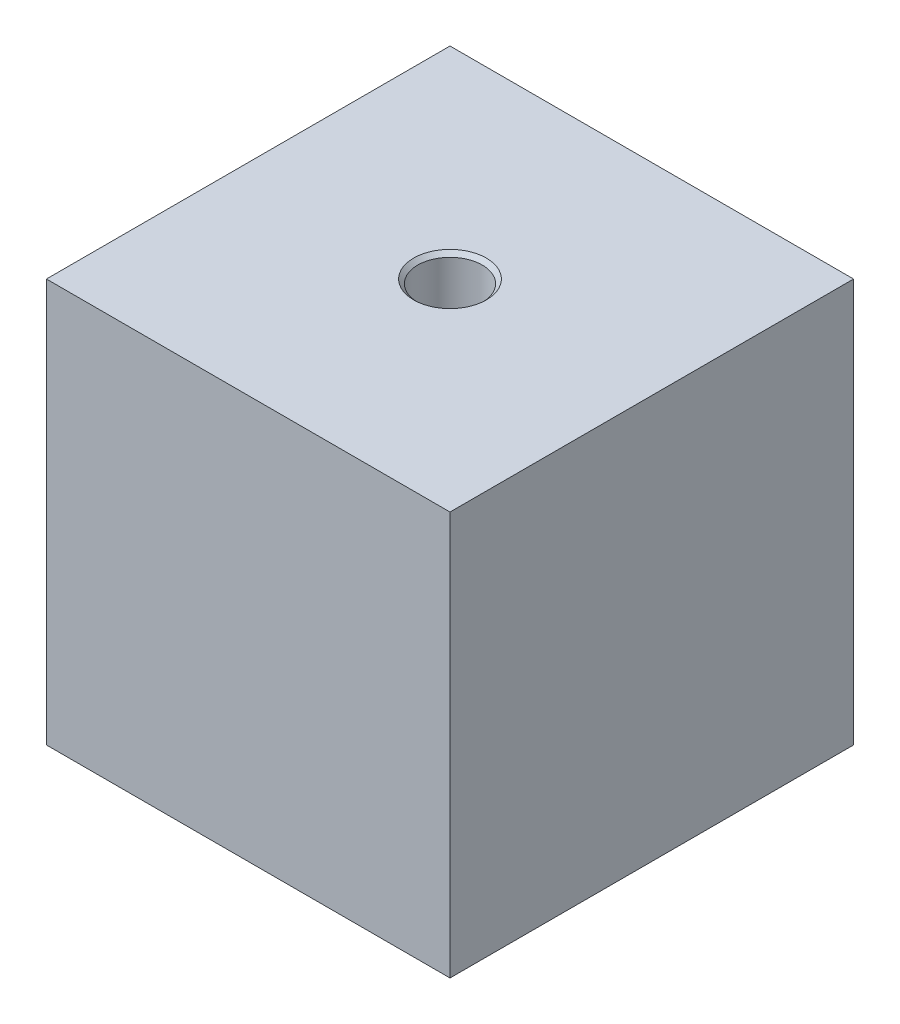
ISO-10303-21;
HEADER;
FILE_DESCRIPTION(('STEP AP214'),'2;1');
FILE_NAME('part.step','',(''),(''),'','','');
FILE_SCHEMA(('AUTOMOTIVE_DESIGN { 1 0 10303 214 1 1 1 1 }'));
ENDSEC;
DATA;
#1=APPLICATION_CONTEXT('core data for automotive mechanical design processes');
#2=APPLICATION_PROTOCOL_DEFINITION('international standard','automotive_design',2000,#1);
#3=PRODUCT_CONTEXT('',#1,'mechanical');
#4=PRODUCT('Part','Part','',(#3));
#5=PRODUCT_RELATED_PRODUCT_CATEGORY('part','',(#4));
#6=PRODUCT_DEFINITION_FORMATION('','',#4);
#7=PRODUCT_DEFINITION_CONTEXT('part definition',#1,'design');
#8=PRODUCT_DEFINITION('design','',#6,#7);
#9=PRODUCT_DEFINITION_SHAPE('','',#8);
#10=(LENGTH_UNIT() NAMED_UNIT(*) SI_UNIT(.MILLI.,.METRE.));
#11=(NAMED_UNIT(*) PLANE_ANGLE_UNIT() SI_UNIT($,.RADIAN.));
#12=(NAMED_UNIT(*) SI_UNIT($,.STERADIAN.) SOLID_ANGLE_UNIT());
#13=UNCERTAINTY_MEASURE_WITH_UNIT(LENGTH_MEASURE(1.E-05),#10,'distance_accuracy_value','');
#14=(GEOMETRIC_REPRESENTATION_CONTEXT(3) GLOBAL_UNCERTAINTY_ASSIGNED_CONTEXT((#13)) GLOBAL_UNIT_ASSIGNED_CONTEXT((#10,
#11,#12)) REPRESENTATION_CONTEXT('',''));
#15=CARTESIAN_POINT('',(0.,0.,0.));
#16=DIRECTION('',(0.,0.,1.));
#17=DIRECTION('',(1.,0.,0.));
#18=AXIS2_PLACEMENT_3D('',#15,#16,#17);
#19=CARTESIAN_POINT('',(0.,-30.7982756057297,25.));
#20=DIRECTION('',(0.,1.,0.));
#21=DIRECTION('',(0.,0.,1.));
#22=AXIS2_PLACEMENT_3D('',#19,#20,#21);
#23=CYLINDRICAL_SURFACE('',#22,2.05);
#24=CARTESIAN_POINT('',(0.,-0.499999999999994,25.));
#25=DIRECTION('',(0.,1.,0.));
#26=DIRECTION('',(0.,0.,1.));
#27=AXIS2_PLACEMENT_3D('',#24,#25,#26);
#28=CIRCLE('',#27,2.05);
#29=CARTESIAN_POINT('',(0.,-0.499999999999994,27.05));
#30=VERTEX_POINT('',#29);
#31=EDGE_CURVE('E11',#30,#30,#28,.T.);
#32=ORIENTED_EDGE('',*,*,#31,.T.);
#33=EDGE_LOOP('',(#32));
#34=FACE_BOUND('',#33,.T.);
#35=CARTESIAN_POINT('',(0.,-25.,25.));
#36=DIRECTION('',(0.,1.,0.));
#37=DIRECTION('',(0.,0.,1.));
#38=AXIS2_PLACEMENT_3D('',#35,#36,#37);
#39=CIRCLE('',#38,2.05);
#40=CARTESIAN_POINT('',(0.,-25.,27.05));
#41=VERTEX_POINT('',#40);
#42=EDGE_CURVE('E115',#41,#41,#39,.F.);
#43=ORIENTED_EDGE('',*,*,#42,.T.);
#44=EDGE_LOOP('',(#43));
#45=FACE_BOUND('',#44,.T.);
#46=ADVANCED_FACE('F43',(#34,#45),#23,.F.);
#47=CARTESIAN_POINT('',(25.,-25.,50.));
#48=DIRECTION('',(-1.,0.,0.));
#49=DIRECTION('',(0.,0.,1.));
#50=AXIS2_PLACEMENT_3D('',#47,#48,#49);
#51=PLANE('',#50);
#52=DIRECTION('',(0.,1.,0.));
#53=VECTOR('',#52,1.);
#54=CARTESIAN_POINT('',(25.,-25.,0.));
#55=LINE('',#54,#53);
#56=CARTESIAN_POINT('',(25.,-25.,0.));
#57=VERTEX_POINT('',#56);
#58=CARTESIAN_POINT('',(25.,25.,0.));
#59=VERTEX_POINT('',#58);
#60=EDGE_CURVE('E112',#57,#59,#55,.T.);
#61=ORIENTED_EDGE('',*,*,#60,.T.);
#62=DIRECTION('',(0.,0.,-1.));
#63=VECTOR('',#62,1.);
#64=CARTESIAN_POINT('',(25.,25.,50.));
#65=LINE('',#64,#63);
#66=CARTESIAN_POINT('',(25.,25.,50.));
#67=VERTEX_POINT('',#66);
#68=EDGE_CURVE('E103',#67,#59,#65,.T.);
#69=ORIENTED_EDGE('',*,*,#68,.F.);
#70=DIRECTION('',(0.,1.,0.));
#71=VECTOR('',#70,1.);
#72=CARTESIAN_POINT('',(25.,-25.,50.));
#73=LINE('',#72,#71);
#74=CARTESIAN_POINT('',(25.,-25.,50.));
#75=VERTEX_POINT('',#74);
#76=EDGE_CURVE('E97',#75,#67,#73,.T.);
#77=ORIENTED_EDGE('',*,*,#76,.F.);
#78=DIRECTION('',(0.,0.,-1.));
#79=VECTOR('',#78,1.);
#80=CARTESIAN_POINT('',(25.,-25.,50.));
#81=LINE('',#80,#79);
#82=EDGE_CURVE('E108',#75,#57,#81,.T.);
#83=ORIENTED_EDGE('',*,*,#82,.T.);
#84=EDGE_LOOP('',(#61,#69,#77,#83));
#85=FACE_BOUND('',#84,.T.);
#86=ADVANCED_FACE('F143',(#85),#51,.F.);
#87=CARTESIAN_POINT('',(-25.,25.,50.));
#88=DIRECTION('',(0.,-1.,0.));
#89=DIRECTION('',(0.,0.,-1.));
#90=AXIS2_PLACEMENT_3D('',#87,#88,#89);
#91=PLANE('',#90);
#92=CARTESIAN_POINT('',(0.,25.,25.));
#93=DIRECTION('',(0.,-1.,0.));
#94=DIRECTION('',(0.,0.,-1.));
#95=AXIS2_PLACEMENT_3D('',#92,#93,#94);
#96=CIRCLE('',#95,4.50000000000003);
#97=CARTESIAN_POINT('',(0.,25.,20.5));
#98=VERTEX_POINT('',#97);
#99=EDGE_CURVE('E125',#98,#98,#96,.T.);
#100=ORIENTED_EDGE('',*,*,#99,.T.);
#101=EDGE_LOOP('',(#100));
#102=FACE_BOUND('',#101,.T.);
#103=DIRECTION('',(-1.,0.,0.));
#104=VECTOR('',#103,1.);
#105=CARTESIAN_POINT('',(-25.,25.,0.));
#106=LINE('',#105,#104);
#107=CARTESIAN_POINT('',(-25.,25.,0.));
#108=VERTEX_POINT('',#107);
#109=EDGE_CURVE('E102',#59,#108,#106,.T.);
#110=ORIENTED_EDGE('',*,*,#109,.T.);
#111=DIRECTION('',(0.,0.,-1.));
#112=VECTOR('',#111,1.);
#113=CARTESIAN_POINT('',(-25.,25.,50.));
#114=LINE('',#113,#112);
#115=CARTESIAN_POINT('',(-25.,25.,50.));
#116=VERTEX_POINT('',#115);
#117=EDGE_CURVE('E100',#116,#108,#114,.T.);
#118=ORIENTED_EDGE('',*,*,#117,.F.);
#119=DIRECTION('',(-1.,0.,0.));
#120=VECTOR('',#119,1.);
#121=CARTESIAN_POINT('',(-25.,25.,50.));
#122=LINE('',#121,#120);
#123=EDGE_CURVE('E92',#67,#116,#122,.T.);
#124=ORIENTED_EDGE('',*,*,#123,.F.);
#125=ORIENTED_EDGE('',*,*,#68,.T.);
#126=EDGE_LOOP('',(#110,#118,#124,#125));
#127=FACE_BOUND('',#126,.T.);
#128=ADVANCED_FACE('F101',(#102,#127),#91,.F.);
#129=CARTESIAN_POINT('',(-25.,-25.,50.));
#130=DIRECTION('',(1.,0.,0.));
#131=DIRECTION('',(0.,0.,-1.));
#132=AXIS2_PLACEMENT_3D('',#129,#130,#131);
#133=PLANE('',#132);
#134=DIRECTION('',(0.,-1.,0.));
#135=VECTOR('',#134,1.);
#136=CARTESIAN_POINT('',(-25.,-25.,0.));
#137=LINE('',#136,#135);
#138=CARTESIAN_POINT('',(-25.,-25.,0.));
#139=VERTEX_POINT('',#138);
#140=EDGE_CURVE('E78',#108,#139,#137,.T.);
#141=ORIENTED_EDGE('',*,*,#140,.T.);
#142=DIRECTION('',(0.,0.,-1.));
#143=VECTOR('',#142,1.);
#144=CARTESIAN_POINT('',(-25.,-25.,50.));
#145=LINE('',#144,#143);
#146=CARTESIAN_POINT('',(-25.,-25.,50.));
#147=VERTEX_POINT('',#146);
#148=EDGE_CURVE('E104',#147,#139,#145,.T.);
#149=ORIENTED_EDGE('',*,*,#148,.F.);
#150=DIRECTION('',(0.,-1.,0.));
#151=VECTOR('',#150,1.);
#152=CARTESIAN_POINT('',(-25.,-25.,50.));
#153=LINE('',#152,#151);
#154=EDGE_CURVE('E95',#116,#147,#153,.T.);
#155=ORIENTED_EDGE('',*,*,#154,.F.);
#156=ORIENTED_EDGE('',*,*,#117,.T.);
#157=EDGE_LOOP('',(#141,#149,#155,#156));
#158=FACE_BOUND('',#157,.T.);
#159=ADVANCED_FACE('F106',(#158),#133,.F.);
#160=CARTESIAN_POINT('',(-25.,-25.,50.));
#161=DIRECTION('',(0.,1.,0.));
#162=DIRECTION('',(0.,0.,1.));
#163=AXIS2_PLACEMENT_3D('',#160,#161,#162);
#164=PLANE('',#163);
#165=ORIENTED_EDGE('',*,*,#42,.F.);
#166=EDGE_LOOP('',(#165));
#167=FACE_BOUND('',#166,.T.);
#168=DIRECTION('',(1.,0.,0.));
#169=VECTOR('',#168,1.);
#170=CARTESIAN_POINT('',(-25.,-25.,0.));
#171=LINE('',#170,#169);
#172=EDGE_CURVE('E84',#139,#57,#171,.T.);
#173=ORIENTED_EDGE('',*,*,#172,.T.);
#174=ORIENTED_EDGE('',*,*,#82,.F.);
#175=DIRECTION('',(1.,0.,0.));
#176=VECTOR('',#175,1.);
#177=CARTESIAN_POINT('',(-25.,-25.,50.));
#178=LINE('',#177,#176);
#179=EDGE_CURVE('E61',#147,#75,#178,.T.);
#180=ORIENTED_EDGE('',*,*,#179,.F.);
#181=ORIENTED_EDGE('',*,*,#148,.T.);
#182=EDGE_LOOP('',(#173,#174,#180,#181));
#183=FACE_BOUND('',#182,.T.);
#184=ADVANCED_FACE('F158',(#167,#183),#164,.F.);
#185=CARTESIAN_POINT('',(0.,0.,50.));
#186=DIRECTION('',(0.,0.,-1.));
#187=DIRECTION('',(-1.,0.,0.));
#188=AXIS2_PLACEMENT_3D('',#185,#186,#187);
#189=PLANE('',#188);
#190=ORIENTED_EDGE('',*,*,#76,.T.);
#191=ORIENTED_EDGE('',*,*,#123,.T.);
#192=ORIENTED_EDGE('',*,*,#154,.T.);
#193=ORIENTED_EDGE('',*,*,#179,.T.);
#194=EDGE_LOOP('',(#190,#191,#192,#193));
#195=FACE_BOUND('',#194,.T.);
#196=ADVANCED_FACE('F93',(#195),#189,.F.);
#197=CARTESIAN_POINT('',(0.,0.,0.));
#198=DIRECTION('',(0.,0.,-1.));
#199=DIRECTION('',(-1.,0.,0.));
#200=AXIS2_PLACEMENT_3D('',#197,#198,#199);
#201=PLANE('',#200);
#202=ORIENTED_EDGE('',*,*,#60,.F.);
#203=ORIENTED_EDGE('',*,*,#172,.F.);
#204=ORIENTED_EDGE('',*,*,#140,.F.);
#205=ORIENTED_EDGE('',*,*,#109,.F.);
#206=EDGE_LOOP('',(#202,#203,#204,#205));
#207=FACE_BOUND('',#206,.T.);
#208=ADVANCED_FACE('F157',(#207),#201,.T.);
#209=CARTESIAN_POINT('',(0.,0.,25.));
#210=DIRECTION('',(0.,1.,0.));
#211=DIRECTION('',(0.,0.,1.));
#212=AXIS2_PLACEMENT_3D('',#209,#210,#211);
#213=PLANE('',#212);
#214=CARTESIAN_POINT('',(0.,0.,25.));
#215=DIRECTION('',(0.,1.,0.));
#216=DIRECTION('',(0.,0.,1.));
#217=AXIS2_PLACEMENT_3D('',#214,#215,#216);
#218=CIRCLE('',#217,2.54999999999999);
#219=CARTESIAN_POINT('',(0.,0.,27.55));
#220=VERTEX_POINT('',#219);
#221=EDGE_CURVE('E53',#220,#220,#218,.F.);
#222=ORIENTED_EDGE('',*,*,#221,.T.);
#223=EDGE_LOOP('',(#222));
#224=FACE_BOUND('',#223,.T.);
#225=CARTESIAN_POINT('',(0.,0.,25.));
#226=DIRECTION('',(0.,1.,0.));
#227=DIRECTION('',(0.,0.,1.));
#228=AXIS2_PLACEMENT_3D('',#225,#226,#227);
#229=CIRCLE('',#228,4.);
#230=CARTESIAN_POINT('',(0.,0.,29.));
#231=VERTEX_POINT('',#230);
#232=EDGE_CURVE('E184',#231,#231,#229,.T.);
#233=ORIENTED_EDGE('',*,*,#232,.T.);
#234=EDGE_LOOP('',(#233));
#235=FACE_BOUND('',#234,.T.);
#236=ADVANCED_FACE('F130',(#224,#235),#213,.T.);
#237=CARTESIAN_POINT('',(0.,0.,25.));
#238=DIRECTION('',(0.,1.,0.));
#239=DIRECTION('',(0.,0.,1.));
#240=AXIS2_PLACEMENT_3D('',#237,#238,#239);
#241=CYLINDRICAL_SURFACE('',#240,4.);
#242=CARTESIAN_POINT('',(0.,24.5,25.));
#243=DIRECTION('',(0.,-1.,0.));
#244=DIRECTION('',(0.,0.,-1.));
#245=AXIS2_PLACEMENT_3D('',#242,#243,#244);
#246=CIRCLE('',#245,4.);
#247=CARTESIAN_POINT('',(0.,24.5,29.));
#248=VERTEX_POINT('',#247);
#249=EDGE_CURVE('E122',#248,#248,#246,.F.);
#250=CARTESIAN_POINT('',(0.,24.5,29.));
#251=CARTESIAN_POINT('',(0.,24.2447916666666,29.));
#252=CARTESIAN_POINT('',(0.,23.9895833333333,29.));
#253=CARTESIAN_POINT('',(0.,23.4791666666666,29.));
#254=CARTESIAN_POINT('',(0.,23.2239583333333,29.));
#255=CARTESIAN_POINT('',(0.,22.7135416666667,29.));
#256=CARTESIAN_POINT('',(0.,22.4583333333333,29.));
#257=CARTESIAN_POINT('',(0.,21.9479166666667,29.));
#258=CARTESIAN_POINT('',(0.,21.6927083333333,29.));
#259=CARTESIAN_POINT('',(0.,21.1822916666667,29.));
#260=CARTESIAN_POINT('',(0.,20.9270833333333,29.));
#261=CARTESIAN_POINT('',(0.,20.4166666666667,29.));
#262=CARTESIAN_POINT('',(0.,20.1614583333333,29.));
#263=CARTESIAN_POINT('',(0.,19.6510416666667,29.));
#264=CARTESIAN_POINT('',(0.,19.3958333333333,29.));
#265=CARTESIAN_POINT('',(0.,18.8854166666667,29.));
#266=CARTESIAN_POINT('',(0.,18.6302083333333,29.));
#267=CARTESIAN_POINT('',(0.,18.1197916666667,29.));
#268=CARTESIAN_POINT('',(0.,17.8645833333333,29.));
#269=CARTESIAN_POINT('',(0.,17.3541666666667,29.));
#270=CARTESIAN_POINT('',(0.,17.0989583333333,29.));
#271=CARTESIAN_POINT('',(0.,16.5885416666667,29.));
#272=CARTESIAN_POINT('',(0.,16.3333333333333,29.));
#273=CARTESIAN_POINT('',(0.,15.8229166666667,29.));
#274=CARTESIAN_POINT('',(0.,15.5677083333333,29.));
#275=CARTESIAN_POINT('',(0.,15.0572916666667,29.));
#276=CARTESIAN_POINT('',(0.,14.8020833333333,29.));
#277=CARTESIAN_POINT('',(0.,14.2916666666667,29.));
#278=CARTESIAN_POINT('',(0.,14.0364583333333,29.));
#279=CARTESIAN_POINT('',(0.,13.5260416666667,29.));
#280=CARTESIAN_POINT('',(0.,13.2708333333333,29.));
#281=CARTESIAN_POINT('',(0.,12.7604166666667,29.));
#282=CARTESIAN_POINT('',(0.,12.5052083333333,29.));
#283=CARTESIAN_POINT('',(0.,11.9947916666667,29.));
#284=CARTESIAN_POINT('',(0.,11.7395833333333,29.));
#285=CARTESIAN_POINT('',(0.,11.2291666666667,29.));
#286=CARTESIAN_POINT('',(0.,10.9739583333333,29.));
#287=CARTESIAN_POINT('',(0.,10.4635416666667,29.));
#288=CARTESIAN_POINT('',(0.,10.2083333333333,29.));
#289=CARTESIAN_POINT('',(0.,9.69791666666666,29.));
#290=CARTESIAN_POINT('',(0.,9.44270833333333,29.));
#291=CARTESIAN_POINT('',(0.,8.93229166666666,29.));
#292=CARTESIAN_POINT('',(0.,8.67708333333333,29.));
#293=CARTESIAN_POINT('',(0.,8.16666666666666,29.));
#294=CARTESIAN_POINT('',(0.,7.91145833333333,29.));
#295=CARTESIAN_POINT('',(0.,7.40104166666666,29.));
#296=CARTESIAN_POINT('',(0.,7.14583333333333,29.));
#297=CARTESIAN_POINT('',(0.,6.63541666666666,29.));
#298=CARTESIAN_POINT('',(0.,6.38020833333333,29.));
#299=CARTESIAN_POINT('',(0.,5.86979166666666,29.));
#300=CARTESIAN_POINT('',(0.,5.61458333333333,29.));
#301=CARTESIAN_POINT('',(0.,5.10416666666667,29.));
#302=CARTESIAN_POINT('',(0.,4.84895833333333,29.));
#303=CARTESIAN_POINT('',(0.,4.33854166666667,29.));
#304=CARTESIAN_POINT('',(0.,4.08333333333333,29.));
#305=CARTESIAN_POINT('',(0.,3.57291666666667,29.));
#306=CARTESIAN_POINT('',(0.,3.31770833333333,29.));
#307=CARTESIAN_POINT('',(0.,2.80729166666667,29.));
#308=CARTESIAN_POINT('',(0.,2.55208333333333,29.));
#309=CARTESIAN_POINT('',(0.,2.04166666666667,29.));
#310=CARTESIAN_POINT('',(0.,1.78645833333333,29.));
#311=CARTESIAN_POINT('',(0.,1.27604166666667,29.));
#312=CARTESIAN_POINT('',(0.,1.02083333333334,29.));
#313=CARTESIAN_POINT('',(0.,0.510416666666669,29.));
#314=CARTESIAN_POINT('',(0.,0.255208333333337,29.));
#315=CARTESIAN_POINT('',(0.,0.,29.));
#316=B_SPLINE_CURVE_WITH_KNOTS('',3,(#250,#251,#252,#253,#254,#255,#256,#257,#258,#259,#260,
#261,#262,#263,#264,#265,#266,#267,#268,#269,#270,#271,#272,#273,#274,#275,#276,#277,#278,#279,
#280,#281,#282,#283,#284,#285,#286,#287,#288,#289,#290,#291,#292,#293,#294,#295,#296,#297,#298,
#299,#300,#301,#302,#303,#304,#305,#306,#307,#308,#309,#310,#311,#312,#313,#314,#315),
.UNSPECIFIED.,.F.,.F.,(4,2,2,2,2,2,2,2,2,2,2,2,2,2,2,2,2,2,2,2,2,2,2,2,2,2,2,2,2,2,2,2,4),(0.,
0.765624999999999,1.53125,2.296875,3.0625,3.828125,4.59375,5.359375,6.12499999999999,
6.89062499999999,7.65624999999999,8.42187499999999,9.18749999999999,9.95312499999999,10.71875,
11.484375,12.25,13.015625,13.78125,14.546875,15.3125,16.078125,16.84375,17.609375,18.375,
19.140625,19.90625,20.671875,21.4375,22.203125,22.96875,23.734375,24.5),.UNSPECIFIED.);
#317=EDGE_CURVE('BSEAM139',#248,#231,#316,.T.);
#318=ORIENTED_EDGE('',*,*,#249,.T.);
#319=ORIENTED_EDGE('',*,*,#232,.F.);
#320=ORIENTED_EDGE('',*,*,#317,.T.);
#321=ORIENTED_EDGE('',*,*,#317,.F.);
#322=EDGE_LOOP('',(#318,#320,#319,#321));
#323=FACE_BOUND('',#322,.T.);
#324=ADVANCED_FACE('F139',(#323),#241,.F.);
#325=CARTESIAN_POINT('',(0.,24.5,25.));
#326=DIRECTION('',(0.,1.,0.));
#327=DIRECTION('',(0.,0.,1.));
#328=AXIS2_PLACEMENT_3D('',#325,#326,#327);
#329=CONICAL_SURFACE('',#328,4.,0.785398163397455);
#330=ORIENTED_EDGE('',*,*,#99,.F.);
#331=EDGE_LOOP('',(#330));
#332=FACE_BOUND('',#331,.T.);
#333=ORIENTED_EDGE('',*,*,#249,.F.);
#334=EDGE_LOOP('',(#333));
#335=FACE_BOUND('',#334,.T.);
#336=ADVANCED_FACE('F134',(#332,#335),#329,.F.);
#337=CARTESIAN_POINT('',(0.,0.,25.));
#338=DIRECTION('',(0.,1.,0.));
#339=DIRECTION('',(0.,0.,1.));
#340=AXIS2_PLACEMENT_3D('',#337,#338,#339);
#341=CONICAL_SURFACE('',#340,2.54999999999999,0.785398163397441);
#342=ORIENTED_EDGE('',*,*,#31,.F.);
#343=EDGE_LOOP('',(#342));
#344=FACE_BOUND('',#343,.T.);
#345=ORIENTED_EDGE('',*,*,#221,.F.);
#346=EDGE_LOOP('',(#345));
#347=FACE_BOUND('',#346,.T.);
#348=ADVANCED_FACE('F46',(#344,#347),#341,.F.);
#349=CLOSED_SHELL('',(#46,#86,#128,#159,#184,#196,#208,#236,#324,#336,#348));
#350=MANIFOLD_SOLID_BREP('B2',#349);
#351=ADVANCED_BREP_SHAPE_REPRESENTATION('',(#18,#350),#14);
#352=SHAPE_DEFINITION_REPRESENTATION(#9,#351);
ENDSEC;
END-ISO-10303-21;
